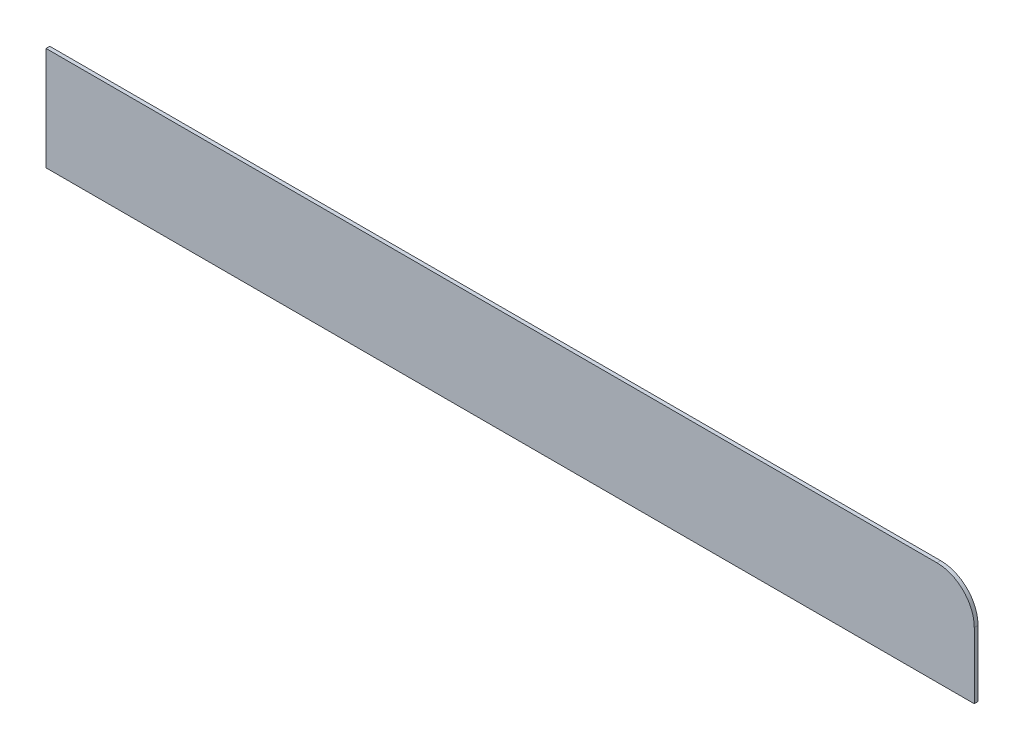
ISO-10303-21;
HEADER;
FILE_DESCRIPTION(('STEP AP214'),'2;1');
FILE_NAME('part.step','',(''),(''),'','','');
FILE_SCHEMA(('AUTOMOTIVE_DESIGN { 1 0 10303 214 1 1 1 1 }'));
ENDSEC;
DATA;
#1=APPLICATION_CONTEXT('core data for automotive mechanical design processes');
#2=APPLICATION_PROTOCOL_DEFINITION('international standard','automotive_design',2000,#1);
#3=PRODUCT_CONTEXT('',#1,'mechanical');
#4=PRODUCT('Part','Part','',(#3));
#5=PRODUCT_RELATED_PRODUCT_CATEGORY('part','',(#4));
#6=PRODUCT_DEFINITION_FORMATION('','',#4);
#7=PRODUCT_DEFINITION_CONTEXT('part definition',#1,'design');
#8=PRODUCT_DEFINITION('design','',#6,#7);
#9=PRODUCT_DEFINITION_SHAPE('','',#8);
#10=(LENGTH_UNIT() NAMED_UNIT(*) SI_UNIT(.MILLI.,.METRE.));
#11=(NAMED_UNIT(*) PLANE_ANGLE_UNIT() SI_UNIT($,.RADIAN.));
#12=(NAMED_UNIT(*) SI_UNIT($,.STERADIAN.) SOLID_ANGLE_UNIT());
#13=UNCERTAINTY_MEASURE_WITH_UNIT(LENGTH_MEASURE(1.E-05),#10,'distance_accuracy_value','');
#14=(GEOMETRIC_REPRESENTATION_CONTEXT(3) GLOBAL_UNCERTAINTY_ASSIGNED_CONTEXT((#13)) GLOBAL_UNIT_ASSIGNED_CONTEXT((#10,
#11,#12)) REPRESENTATION_CONTEXT('',''));
#15=CARTESIAN_POINT('',(0.,0.,0.));
#16=DIRECTION('',(0.,0.,1.));
#17=DIRECTION('',(1.,0.,0.));
#18=AXIS2_PLACEMENT_3D('',#15,#16,#17);
#19=CARTESIAN_POINT('',(711.992264213415,10.,3.));
#20=DIRECTION('',(0.,0.,-1.));
#21=DIRECTION('',(-1.,0.,0.));
#22=AXIS2_PLACEMENT_3D('',#19,#20,#21);
#23=CYLINDRICAL_SURFACE('',#22,30.);
#24=CARTESIAN_POINT('',(711.992264213415,10.,0.));
#25=DIRECTION('',(0.,0.,1.));
#26=DIRECTION('',(-1.,0.,0.));
#27=AXIS2_PLACEMENT_3D('',#24,#25,#26);
#28=CIRCLE('',#27,30.);
#29=CARTESIAN_POINT('',(741.992264213415,9.99999999999979,0.));
#30=VERTEX_POINT('',#29);
#31=CARTESIAN_POINT('',(711.992264213415,40.,0.));
#32=VERTEX_POINT('',#31);
#33=EDGE_CURVE('E109',#30,#32,#28,.T.);
#34=ORIENTED_EDGE('',*,*,#33,.T.);
#35=DIRECTION('',(0.,0.,-1.));
#36=VECTOR('',#35,1.);
#37=CARTESIAN_POINT('',(711.992264213415,40.,3.));
#38=LINE('',#37,#36);
#39=CARTESIAN_POINT('',(711.992264213415,40.,3.));
#40=VERTEX_POINT('',#39);
#41=EDGE_CURVE('E11',#40,#32,#38,.T.);
#42=ORIENTED_EDGE('',*,*,#41,.F.);
#43=CARTESIAN_POINT('',(711.992264213415,10.,3.));
#44=DIRECTION('',(0.,0.,1.));
#45=DIRECTION('',(-1.,0.,0.));
#46=AXIS2_PLACEMENT_3D('',#43,#44,#45);
#47=CIRCLE('',#46,30.);
#48=CARTESIAN_POINT('',(741.992264213415,9.99999999999979,3.));
#49=VERTEX_POINT('',#48);
#50=EDGE_CURVE('E117',#49,#40,#47,.T.);
#51=ORIENTED_EDGE('',*,*,#50,.F.);
#52=DIRECTION('',(0.,0.,-1.));
#53=VECTOR('',#52,1.);
#54=CARTESIAN_POINT('',(741.992264213415,9.99999999999979,3.));
#55=LINE('',#54,#53);
#56=EDGE_CURVE('E105',#49,#30,#55,.T.);
#57=ORIENTED_EDGE('',*,*,#56,.T.);
#58=EDGE_LOOP('',(#34,#42,#51,#57));
#59=FACE_BOUND('',#58,.T.);
#60=ADVANCED_FACE('F35',(#59),#23,.T.);
#61=CARTESIAN_POINT('',(-3.,40.,3.));
#62=DIRECTION('',(0.,-1.,0.));
#63=DIRECTION('',(0.,0.,-1.));
#64=AXIS2_PLACEMENT_3D('',#61,#62,#63);
#65=PLANE('',#64);
#66=DIRECTION('',(-1.,0.,0.));
#67=VECTOR('',#66,1.);
#68=CARTESIAN_POINT('',(-3.,40.,0.));
#69=LINE('',#68,#67);
#70=CARTESIAN_POINT('',(-3.,40.,0.));
#71=VERTEX_POINT('',#70);
#72=EDGE_CURVE('E112',#32,#71,#69,.T.);
#73=ORIENTED_EDGE('',*,*,#72,.T.);
#74=DIRECTION('',(0.,0.,-1.));
#75=VECTOR('',#74,1.);
#76=CARTESIAN_POINT('',(-3.,40.,3.));
#77=LINE('',#76,#75);
#78=CARTESIAN_POINT('',(-3.,40.,3.));
#79=VERTEX_POINT('',#78);
#80=EDGE_CURVE('E43',#79,#71,#77,.T.);
#81=ORIENTED_EDGE('',*,*,#80,.F.);
#82=DIRECTION('',(-1.,0.,0.));
#83=VECTOR('',#82,1.);
#84=CARTESIAN_POINT('',(-3.,40.,3.));
#85=LINE('',#84,#83);
#86=EDGE_CURVE('E85',#40,#79,#85,.T.);
#87=ORIENTED_EDGE('',*,*,#86,.F.);
#88=ORIENTED_EDGE('',*,*,#41,.T.);
#89=EDGE_LOOP('',(#73,#81,#87,#88));
#90=FACE_BOUND('',#89,.T.);
#91=ADVANCED_FACE('F136',(#90),#65,.F.);
#92=CARTESIAN_POINT('',(-3.,40.,3.));
#93=DIRECTION('',(1.,0.,0.));
#94=DIRECTION('',(0.,0.,-1.));
#95=AXIS2_PLACEMENT_3D('',#92,#93,#94);
#96=PLANE('',#95);
#97=DIRECTION('',(0.,-1.,0.));
#98=VECTOR('',#97,1.);
#99=CARTESIAN_POINT('',(-3.,40.,0.));
#100=LINE('',#99,#98);
#101=CARTESIAN_POINT('',(-3.,-42.999999999996,0.));
#102=VERTEX_POINT('',#101);
#103=EDGE_CURVE('E100',#71,#102,#100,.T.);
#104=ORIENTED_EDGE('',*,*,#103,.T.);
#105=DIRECTION('',(0.,0.,-1.));
#106=VECTOR('',#105,1.);
#107=CARTESIAN_POINT('',(-3.,-42.999999999996,3.));
#108=LINE('',#107,#106);
#109=CARTESIAN_POINT('',(-3.,-42.999999999996,3.));
#110=VERTEX_POINT('',#109);
#111=EDGE_CURVE('E97',#110,#102,#108,.T.);
#112=ORIENTED_EDGE('',*,*,#111,.F.);
#113=DIRECTION('',(0.,-1.,0.));
#114=VECTOR('',#113,1.);
#115=CARTESIAN_POINT('',(-3.,40.,3.));
#116=LINE('',#115,#114);
#117=EDGE_CURVE('E89',#79,#110,#116,.T.);
#118=ORIENTED_EDGE('',*,*,#117,.F.);
#119=ORIENTED_EDGE('',*,*,#80,.T.);
#120=EDGE_LOOP('',(#104,#112,#118,#119));
#121=FACE_BOUND('',#120,.T.);
#122=ADVANCED_FACE('F98',(#121),#96,.F.);
#123=CARTESIAN_POINT('',(-3.,-42.999999999996,3.));
#124=DIRECTION('',(0.,1.,0.));
#125=DIRECTION('',(0.,0.,1.));
#126=AXIS2_PLACEMENT_3D('',#123,#124,#125);
#127=PLANE('',#126);
#128=DIRECTION('',(1.,0.,0.));
#129=VECTOR('',#128,1.);
#130=CARTESIAN_POINT('',(-3.,-42.999999999996,0.));
#131=LINE('',#130,#129);
#132=CARTESIAN_POINT('',(741.992264213415,-42.999999999996,0.));
#133=VERTEX_POINT('',#132);
#134=EDGE_CURVE('E71',#102,#133,#131,.T.);
#135=ORIENTED_EDGE('',*,*,#134,.T.);
#136=DIRECTION('',(0.,0.,-1.));
#137=VECTOR('',#136,1.);
#138=CARTESIAN_POINT('',(741.992264213415,-42.999999999996,3.));
#139=LINE('',#138,#137);
#140=CARTESIAN_POINT('',(741.992264213415,-42.999999999996,3.));
#141=VERTEX_POINT('',#140);
#142=EDGE_CURVE('E101',#141,#133,#139,.T.);
#143=ORIENTED_EDGE('',*,*,#142,.F.);
#144=DIRECTION('',(1.,0.,0.));
#145=VECTOR('',#144,1.);
#146=CARTESIAN_POINT('',(-3.,-42.999999999996,3.));
#147=LINE('',#146,#145);
#148=EDGE_CURVE('E93',#110,#141,#147,.T.);
#149=ORIENTED_EDGE('',*,*,#148,.F.);
#150=ORIENTED_EDGE('',*,*,#111,.T.);
#151=EDGE_LOOP('',(#135,#143,#149,#150));
#152=FACE_BOUND('',#151,.T.);
#153=ADVANCED_FACE('F103',(#152),#127,.F.);
#154=CARTESIAN_POINT('',(741.992264213415,9.99999999999979,3.));
#155=DIRECTION('',(-1.,0.,0.));
#156=DIRECTION('',(0.,0.,1.));
#157=AXIS2_PLACEMENT_3D('',#154,#155,#156);
#158=PLANE('',#157);
#159=DIRECTION('',(0.,1.,0.));
#160=VECTOR('',#159,1.);
#161=CARTESIAN_POINT('',(741.992264213415,9.99999999999979,0.));
#162=LINE('',#161,#160);
#163=EDGE_CURVE('E77',#133,#30,#162,.T.);
#164=ORIENTED_EDGE('',*,*,#163,.T.);
#165=ORIENTED_EDGE('',*,*,#56,.F.);
#166=DIRECTION('',(0.,1.,0.));
#167=VECTOR('',#166,1.);
#168=CARTESIAN_POINT('',(741.992264213415,9.99999999999979,3.));
#169=LINE('',#168,#167);
#170=EDGE_CURVE('E51',#141,#49,#169,.T.);
#171=ORIENTED_EDGE('',*,*,#170,.F.);
#172=ORIENTED_EDGE('',*,*,#142,.T.);
#173=EDGE_LOOP('',(#164,#165,#171,#172));
#174=FACE_BOUND('',#173,.T.);
#175=ADVANCED_FACE('F125',(#174),#158,.F.);
#176=CARTESIAN_POINT('',(711.992264213415,10.,3.));
#177=DIRECTION('',(0.,0.,-1.));
#178=DIRECTION('',(-1.,0.,0.));
#179=AXIS2_PLACEMENT_3D('',#176,#177,#178);
#180=PLANE('',#179);
#181=ORIENTED_EDGE('',*,*,#50,.T.);
#182=ORIENTED_EDGE('',*,*,#86,.T.);
#183=ORIENTED_EDGE('',*,*,#117,.T.);
#184=ORIENTED_EDGE('',*,*,#148,.T.);
#185=ORIENTED_EDGE('',*,*,#170,.T.);
#186=EDGE_LOOP('',(#181,#182,#183,#184,#185));
#187=FACE_BOUND('',#186,.T.);
#188=ADVANCED_FACE('F91',(#187),#180,.F.);
#189=CARTESIAN_POINT('',(711.992264213415,10.,0.));
#190=DIRECTION('',(0.,0.,-1.));
#191=DIRECTION('',(-1.,0.,0.));
#192=AXIS2_PLACEMENT_3D('',#189,#190,#191);
#193=PLANE('',#192);
#194=ORIENTED_EDGE('',*,*,#33,.F.);
#195=ORIENTED_EDGE('',*,*,#163,.F.);
#196=ORIENTED_EDGE('',*,*,#134,.F.);
#197=ORIENTED_EDGE('',*,*,#103,.F.);
#198=ORIENTED_EDGE('',*,*,#72,.F.);
#199=EDGE_LOOP('',(#194,#195,#196,#197,#198));
#200=FACE_BOUND('',#199,.T.);
#201=ADVANCED_FACE('F121',(#200),#193,.T.);
#202=CLOSED_SHELL('',(#60,#91,#122,#153,#175,#188,#201));
#203=MANIFOLD_SOLID_BREP('B2',#202);
#204=ADVANCED_BREP_SHAPE_REPRESENTATION('',(#18,#203),#14);
#205=SHAPE_DEFINITION_REPRESENTATION(#9,#204);
ENDSEC;
END-ISO-10303-21;
